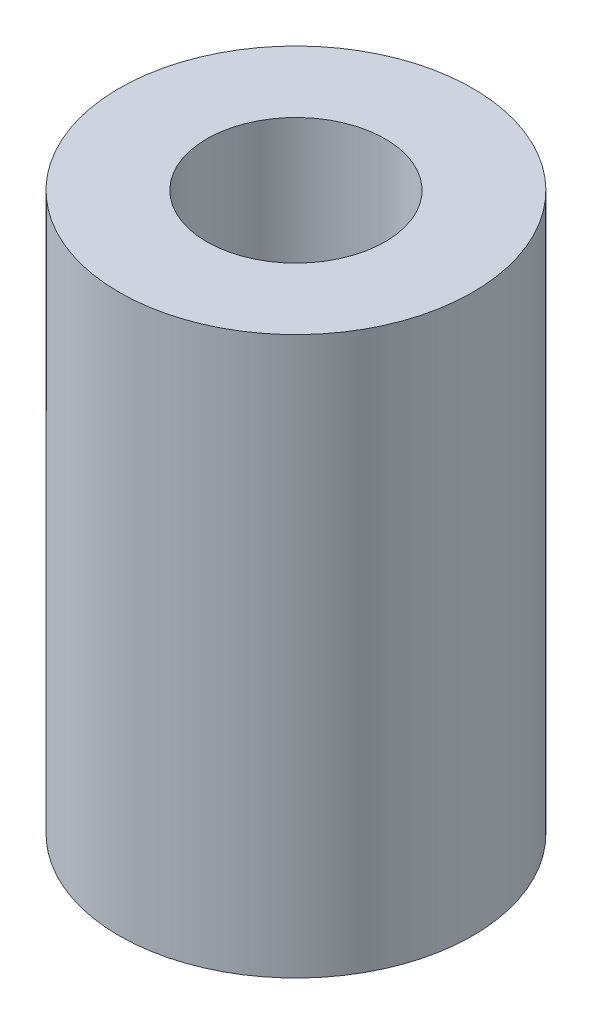
ISO-10303-21;
HEADER;
FILE_DESCRIPTION(('STEP AP214'),'2;1');
FILE_NAME('part.step','',(''),(''),'','','');
FILE_SCHEMA(('AUTOMOTIVE_DESIGN { 1 0 10303 214 1 1 1 1 }'));
ENDSEC;
DATA;
#1=APPLICATION_CONTEXT('core data for automotive mechanical design processes');
#2=APPLICATION_PROTOCOL_DEFINITION('international standard','automotive_design',2000,#1);
#3=PRODUCT_CONTEXT('',#1,'mechanical');
#4=PRODUCT('Part','Part','',(#3));
#5=PRODUCT_RELATED_PRODUCT_CATEGORY('part','',(#4));
#6=PRODUCT_DEFINITION_FORMATION('','',#4);
#7=PRODUCT_DEFINITION_CONTEXT('part definition',#1,'design');
#8=PRODUCT_DEFINITION('design','',#6,#7);
#9=PRODUCT_DEFINITION_SHAPE('','',#8);
#10=(LENGTH_UNIT() NAMED_UNIT(*) SI_UNIT(.MILLI.,.METRE.));
#11=(NAMED_UNIT(*) PLANE_ANGLE_UNIT() SI_UNIT($,.RADIAN.));
#12=(NAMED_UNIT(*) SI_UNIT($,.STERADIAN.) SOLID_ANGLE_UNIT());
#13=UNCERTAINTY_MEASURE_WITH_UNIT(LENGTH_MEASURE(1.E-05),#10,'distance_accuracy_value','');
#14=(GEOMETRIC_REPRESENTATION_CONTEXT(3) GLOBAL_UNCERTAINTY_ASSIGNED_CONTEXT((#13)) GLOBAL_UNIT_ASSIGNED_CONTEXT((#10,
#11,#12)) REPRESENTATION_CONTEXT('',''));
#15=CARTESIAN_POINT('',(0.,0.,0.));
#16=DIRECTION('',(0.,0.,1.));
#17=DIRECTION('',(1.,0.,0.));
#18=AXIS2_PLACEMENT_3D('',#15,#16,#17);
#19=CARTESIAN_POINT('',(0.,25.146,0.));
#20=DIRECTION('',(0.,1.,0.));
#21=DIRECTION('',(0.,0.,1.));
#22=AXIS2_PLACEMENT_3D('',#19,#20,#21);
#23=PLANE('',#22);
#24=CARTESIAN_POINT('',(0.,25.146,0.));
#25=DIRECTION('',(0.,1.,0.));
#26=DIRECTION('',(0.,0.,1.));
#27=AXIS2_PLACEMENT_3D('',#24,#25,#26);
#28=CIRCLE('',#27,7.9756);
#29=CARTESIAN_POINT('',(0.,25.146,7.9756));
#30=VERTEX_POINT('',#29);
#31=EDGE_CURVE('E10',#30,#30,#28,.T.);
#32=ORIENTED_EDGE('',*,*,#31,.T.);
#33=EDGE_LOOP('',(#32));
#34=FACE_BOUND('',#33,.T.);
#35=CARTESIAN_POINT('',(0.,25.146,0.));
#36=DIRECTION('',(0.,1.,0.));
#37=DIRECTION('',(0.,0.,1.));
#38=AXIS2_PLACEMENT_3D('',#35,#36,#37);
#39=CIRCLE('',#38,4.0259);
#40=CARTESIAN_POINT('',(0.,25.146,4.0259));
#41=VERTEX_POINT('',#40);
#42=EDGE_CURVE('E42',#41,#41,#39,.T.);
#43=ORIENTED_EDGE('',*,*,#42,.F.);
#44=EDGE_LOOP('',(#43));
#45=FACE_BOUND('',#44,.T.);
#46=ADVANCED_FACE('F31',(#34,#45),#23,.T.);
#47=CARTESIAN_POINT('',(0.,0.,0.));
#48=DIRECTION('',(0.,1.,0.));
#49=DIRECTION('',(0.,0.,1.));
#50=AXIS2_PLACEMENT_3D('',#47,#48,#49);
#51=PLANE('',#50);
#52=CARTESIAN_POINT('',(0.,0.,0.));
#53=DIRECTION('',(0.,1.,0.));
#54=DIRECTION('',(0.,0.,1.));
#55=AXIS2_PLACEMENT_3D('',#52,#53,#54);
#56=CIRCLE('',#55,7.9756);
#57=CARTESIAN_POINT('',(0.,0.,7.9756));
#58=VERTEX_POINT('',#57);
#59=EDGE_CURVE('E35',#58,#58,#56,.T.);
#60=ORIENTED_EDGE('',*,*,#59,.F.);
#61=EDGE_LOOP('',(#60));
#62=FACE_BOUND('',#61,.T.);
#63=CARTESIAN_POINT('',(0.,0.,0.));
#64=DIRECTION('',(0.,1.,0.));
#65=DIRECTION('',(0.,0.,1.));
#66=AXIS2_PLACEMENT_3D('',#63,#64,#65);
#67=CIRCLE('',#66,4.0259);
#68=CARTESIAN_POINT('',(0.,0.,4.0259));
#69=VERTEX_POINT('',#68);
#70=EDGE_CURVE('E44',#69,#69,#67,.T.);
#71=ORIENTED_EDGE('',*,*,#70,.T.);
#72=EDGE_LOOP('',(#71));
#73=FACE_BOUND('',#72,.T.);
#74=ADVANCED_FACE('F54',(#62,#73),#51,.F.);
#75=CARTESIAN_POINT('',(0.,25.146,0.));
#76=DIRECTION('',(0.,-1.,0.));
#77=DIRECTION('',(0.,0.,-1.));
#78=AXIS2_PLACEMENT_3D('',#75,#76,#77);
#79=CYLINDRICAL_SURFACE('',#78,7.9756);
#80=ORIENTED_EDGE('',*,*,#31,.F.);
#81=EDGE_LOOP('',(#80));
#82=FACE_BOUND('',#81,.T.);
#83=ORIENTED_EDGE('',*,*,#59,.T.);
#84=EDGE_LOOP('',(#83));
#85=FACE_BOUND('',#84,.T.);
#86=ADVANCED_FACE('F33',(#82,#85),#79,.T.);
#87=CARTESIAN_POINT('',(0.,25.146,0.));
#88=DIRECTION('',(0.,-1.,0.));
#89=DIRECTION('',(0.,0.,-1.));
#90=AXIS2_PLACEMENT_3D('',#87,#88,#89);
#91=CYLINDRICAL_SURFACE('',#90,4.0259);
#92=ORIENTED_EDGE('',*,*,#42,.T.);
#93=EDGE_LOOP('',(#92));
#94=FACE_BOUND('',#93,.T.);
#95=ORIENTED_EDGE('',*,*,#70,.F.);
#96=EDGE_LOOP('',(#95));
#97=FACE_BOUND('',#96,.T.);
#98=ADVANCED_FACE('F50',(#94,#97),#91,.F.);
#99=CLOSED_SHELL('',(#46,#74,#86,#98));
#100=MANIFOLD_SOLID_BREP('B2',#99);
#101=ADVANCED_BREP_SHAPE_REPRESENTATION('',(#18,#100),#14);
#102=SHAPE_DEFINITION_REPRESENTATION(#9,#101);
ENDSEC;
END-ISO-10303-21;
